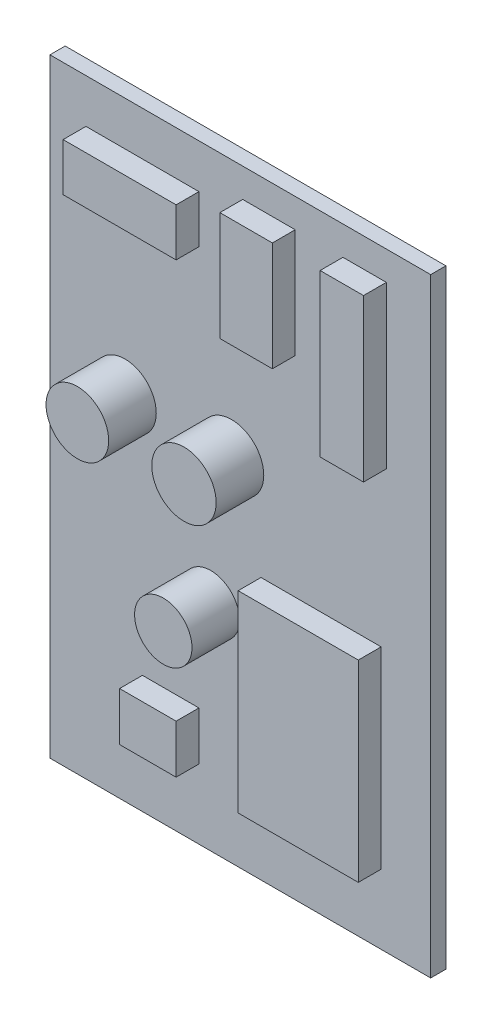
ISO-10303-21;
HEADER;
FILE_DESCRIPTION(('STEP AP214'),'2;1');
FILE_NAME('part.step','',(''),(''),'','','');
FILE_SCHEMA(('AUTOMOTIVE_DESIGN { 1 0 10303 214 1 1 1 1 }'));
ENDSEC;
DATA;
#1=APPLICATION_CONTEXT('core data for automotive mechanical design processes');
#2=APPLICATION_PROTOCOL_DEFINITION('international standard','automotive_design',2000,#1);
#3=PRODUCT_CONTEXT('',#1,'mechanical');
#4=PRODUCT('Part','Part','',(#3));
#5=PRODUCT_RELATED_PRODUCT_CATEGORY('part','',(#4));
#6=PRODUCT_DEFINITION_FORMATION('','',#4);
#7=PRODUCT_DEFINITION_CONTEXT('part definition',#1,'design');
#8=PRODUCT_DEFINITION('design','',#6,#7);
#9=PRODUCT_DEFINITION_SHAPE('','',#8);
#10=(LENGTH_UNIT() NAMED_UNIT(*) SI_UNIT(.MILLI.,.METRE.));
#11=(NAMED_UNIT(*) PLANE_ANGLE_UNIT() SI_UNIT($,.RADIAN.));
#12=(NAMED_UNIT(*) SI_UNIT($,.STERADIAN.) SOLID_ANGLE_UNIT());
#13=UNCERTAINTY_MEASURE_WITH_UNIT(LENGTH_MEASURE(1.E-05),#10,'distance_accuracy_value','');
#14=(GEOMETRIC_REPRESENTATION_CONTEXT(3) GLOBAL_UNCERTAINTY_ASSIGNED_CONTEXT((#13)) GLOBAL_UNIT_ASSIGNED_CONTEXT((#10,
#11,#12)) REPRESENTATION_CONTEXT('',''));
#15=CARTESIAN_POINT('',(0.,0.,0.));
#16=DIRECTION('',(0.,0.,1.));
#17=DIRECTION('',(1.,0.,0.));
#18=AXIS2_PLACEMENT_3D('',#15,#16,#17);
#19=CARTESIAN_POINT('',(0.,0.,1.016));
#20=DIRECTION('',(0.,0.,1.));
#21=DIRECTION('',(1.,0.,0.));
#22=AXIS2_PLACEMENT_3D('',#19,#20,#21);
#23=PLANE('',#22);
#24=CARTESIAN_POINT('',(-11.7065261025188,-8.86064125228403,1.016));
#25=DIRECTION('',(0.,0.,1.));
#26=DIRECTION('',(1.,0.,0.));
#27=AXIS2_PLACEMENT_3D('',#24,#25,#26);
#28=CIRCLE('',#27,1.91392440453094);
#29=CARTESIAN_POINT('',(-9.79260169798782,-8.86064125228403,1.016));
#30=VERTEX_POINT('',#29);
#31=EDGE_CURVE('E365',#30,#30,#28,.T.);
#32=ORIENTED_EDGE('',*,*,#31,.F.);
#33=EDGE_LOOP('',(#32));
#34=FACE_BOUND('',#33,.T.);
#35=CARTESIAN_POINT('',(-10.3263755869391,0.322667947534334,1.016));
#36=DIRECTION('',(0.,0.,1.));
#37=DIRECTION('',(1.,0.,0.));
#38=AXIS2_PLACEMENT_3D('',#35,#36,#37);
#39=CIRCLE('',#38,2.14768562154534);
#40=CARTESIAN_POINT('',(-8.17868996539378,0.322667947534334,1.016));
#41=VERTEX_POINT('',#40);
#42=EDGE_CURVE('E371',#41,#41,#39,.T.);
#43=ORIENTED_EDGE('',*,*,#42,.F.);
#44=EDGE_LOOP('',(#43));
#45=FACE_BOUND('',#44,.T.);
#46=CARTESIAN_POINT('',(-17.439459013388,0.322667947534334,1.016));
#47=DIRECTION('',(0.,0.,1.));
#48=DIRECTION('',(1.,0.,0.));
#49=AXIS2_PLACEMENT_3D('',#46,#47,#48);
#50=CIRCLE('',#49,2.08919420684247);
#51=CARTESIAN_POINT('',(-15.3502648065456,0.322667947534334,1.016));
#52=VERTEX_POINT('',#51);
#53=EDGE_CURVE('E374',#52,#52,#50,.T.);
#54=ORIENTED_EDGE('',*,*,#53,.F.);
#55=EDGE_LOOP('',(#54));
#56=FACE_BOUND('',#55,.T.);
#57=DIRECTION('',(0.,-1.,0.));
#58=VECTOR('',#57,1.);
#59=CARTESIAN_POINT('',(-22.4424657534247,17.4842465753425,1.016));
#60=LINE('',#59,#58);
#61=CARTESIAN_POINT('',(-22.4424657534247,17.4842465753425,1.016));
#62=VERTEX_POINT('',#61);
#63=CARTESIAN_POINT('',(-22.4424657534247,-23.1557534246575,1.016));
#64=VERTEX_POINT('',#63);
#65=EDGE_CURVE('E383',#62,#64,#60,.T.);
#66=ORIENTED_EDGE('',*,*,#65,.T.);
#67=DIRECTION('',(1.,0.,0.));
#68=VECTOR('',#67,1.);
#69=CARTESIAN_POINT('',(-22.4424657534247,-23.1557534246575,1.016));
#70=LINE('',#69,#68);
#71=CARTESIAN_POINT('',(2.95753424657534,-23.1557534246575,1.016));
#72=VERTEX_POINT('',#71);
#73=EDGE_CURVE('E386',#64,#72,#70,.T.);
#74=ORIENTED_EDGE('',*,*,#73,.T.);
#75=DIRECTION('',(0.,1.,0.));
#76=VECTOR('',#75,1.);
#77=CARTESIAN_POINT('',(2.95753424657534,17.4842465753425,1.016));
#78=LINE('',#77,#76);
#79=CARTESIAN_POINT('',(2.95753424657534,17.4842465753425,1.016));
#80=VERTEX_POINT('',#79);
#81=EDGE_CURVE('E389',#72,#80,#78,.T.);
#82=ORIENTED_EDGE('',*,*,#81,.T.);
#83=DIRECTION('',(-1.,0.,0.));
#84=VECTOR('',#83,1.);
#85=CARTESIAN_POINT('',(-22.4424657534247,17.4842465753425,1.016));
#86=LINE('',#85,#84);
#87=EDGE_CURVE('E391',#80,#62,#86,.T.);
#88=ORIENTED_EDGE('',*,*,#87,.T.);
#89=EDGE_LOOP('',(#66,#74,#82,#88));
#90=FACE_BOUND('',#89,.T.);
#91=DIRECTION('',(-1.,0.,0.));
#92=VECTOR('',#91,1.);
#93=CARTESIAN_POINT('',(0.,4.78161576709931,1.016));
#94=LINE('',#93,#92);
#95=CARTESIAN_POINT('',(0.,4.78161576709931,1.016));
#96=VERTEX_POINT('',#95);
#97=CARTESIAN_POINT('',(-2.89479588766414,4.78161576709931,1.016));
#98=VERTEX_POINT('',#97);
#99=EDGE_CURVE('E358',#96,#98,#94,.T.);
#100=ORIENTED_EDGE('',*,*,#99,.T.);
#101=DIRECTION('',(0.,1.,0.));
#102=VECTOR('',#101,1.);
#103=CARTESIAN_POINT('',(-2.89479588766414,0.,1.016));
#104=LINE('',#103,#102);
#105=CARTESIAN_POINT('',(-2.89479588766414,15.557406331048,1.016));
#106=VERTEX_POINT('',#105);
#107=EDGE_CURVE('E361',#98,#106,#104,.T.);
#108=ORIENTED_EDGE('',*,*,#107,.T.);
#109=DIRECTION('',(1.,0.,0.));
#110=VECTOR('',#109,1.);
#111=CARTESIAN_POINT('',(0.,15.557406331048,1.016));
#112=LINE('',#111,#110);
#113=CARTESIAN_POINT('',(0.,15.557406331048,1.016));
#114=VERTEX_POINT('',#113);
#115=EDGE_CURVE('E352',#106,#114,#112,.T.);
#116=ORIENTED_EDGE('',*,*,#115,.T.);
#117=DIRECTION('',(0.,-1.,0.));
#118=VECTOR('',#117,1.);
#119=CARTESIAN_POINT('',(0.,0.,1.016));
#120=LINE('',#119,#118);
#121=EDGE_CURVE('E355',#114,#96,#120,.T.);
#122=ORIENTED_EDGE('',*,*,#121,.T.);
#123=EDGE_LOOP('',(#100,#108,#116,#122));
#124=FACE_BOUND('',#123,.T.);
#125=DIRECTION('',(-1.,0.,0.));
#126=VECTOR('',#125,1.);
#127=CARTESIAN_POINT('',(0.,8.28507476818609,1.016));
#128=LINE('',#127,#126);
#129=CARTESIAN_POINT('',(-6.07975861592485,8.28507476818609,1.016));
#130=VERTEX_POINT('',#129);
#131=CARTESIAN_POINT('',(-9.58321761701162,8.28507476818609,1.016));
#132=VERTEX_POINT('',#131);
#133=EDGE_CURVE('E326',#130,#132,#128,.T.);
#134=ORIENTED_EDGE('',*,*,#133,.T.);
#135=DIRECTION('',(0.,1.,0.));
#136=VECTOR('',#135,1.);
#137=CARTESIAN_POINT('',(-9.58321761701162,0.,1.016));
#138=LINE('',#137,#136);
#139=CARTESIAN_POINT('',(-9.58321761701162,15.557406331048,1.016));
#140=VERTEX_POINT('',#139);
#141=EDGE_CURVE('E329',#132,#140,#138,.T.);
#142=ORIENTED_EDGE('',*,*,#141,.T.);
#143=DIRECTION('',(1.,0.,0.));
#144=VECTOR('',#143,1.);
#145=CARTESIAN_POINT('',(0.,15.557406331048,1.016));
#146=LINE('',#145,#144);
#147=CARTESIAN_POINT('',(-6.07975861592485,15.557406331048,1.016));
#148=VERTEX_POINT('',#147);
#149=EDGE_CURVE('E320',#140,#148,#146,.T.);
#150=ORIENTED_EDGE('',*,*,#149,.T.);
#151=DIRECTION('',(0.,-1.,0.));
#152=VECTOR('',#151,1.);
#153=CARTESIAN_POINT('',(-6.07975861592485,0.,1.016));
#154=LINE('',#153,#152);
#155=EDGE_CURVE('E323',#148,#130,#154,.T.);
#156=ORIENTED_EDGE('',*,*,#155,.T.);
#157=EDGE_LOOP('',(#134,#142,#150,#156));
#158=FACE_BOUND('',#157,.T.);
#159=DIRECTION('',(-1.,0.,0.));
#160=VECTOR('',#159,1.);
#161=CARTESIAN_POINT('',(0.,11.3638720721714,1.016));
#162=LINE('',#161,#160);
#163=CARTESIAN_POINT('',(-12.5027667845839,11.3638720721714,1.016));
#164=VERTEX_POINT('',#163);
#165=CARTESIAN_POINT('',(-20.0405119081343,11.3638720721714,1.016));
#166=VERTEX_POINT('',#165);
#167=EDGE_CURVE('E294',#164,#166,#162,.T.);
#168=ORIENTED_EDGE('',*,*,#167,.T.);
#169=DIRECTION('',(0.,1.,0.));
#170=VECTOR('',#169,1.);
#171=CARTESIAN_POINT('',(-20.0405119081343,0.,1.016));
#172=LINE('',#171,#170);
#173=CARTESIAN_POINT('',(-20.0405119081343,14.5488348004321,1.016));
#174=VERTEX_POINT('',#173);
#175=EDGE_CURVE('E297',#166,#174,#172,.T.);
#176=ORIENTED_EDGE('',*,*,#175,.T.);
#177=DIRECTION('',(1.,0.,0.));
#178=VECTOR('',#177,1.);
#179=CARTESIAN_POINT('',(0.,14.5488348004321,1.016));
#180=LINE('',#179,#178);
#181=CARTESIAN_POINT('',(-12.5027667845839,14.5488348004321,1.016));
#182=VERTEX_POINT('',#181);
#183=EDGE_CURVE('E288',#174,#182,#180,.T.);
#184=ORIENTED_EDGE('',*,*,#183,.T.);
#185=DIRECTION('',(0.,-1.,0.));
#186=VECTOR('',#185,1.);
#187=CARTESIAN_POINT('',(-12.5027667845839,0.,1.016));
#188=LINE('',#187,#186);
#189=EDGE_CURVE('E291',#182,#164,#188,.T.);
#190=ORIENTED_EDGE('',*,*,#189,.T.);
#191=EDGE_LOOP('',(#168,#176,#184,#190));
#192=FACE_BOUND('',#191,.T.);
#193=DIRECTION('',(-1.,0.,0.));
#194=VECTOR('',#193,1.);
#195=CARTESIAN_POINT('',(0.,-18.5216948613415,1.016));
#196=LINE('',#195,#194);
#197=CARTESIAN_POINT('',(-12.5027667845839,-18.5216948613415,1.016));
#198=VERTEX_POINT('',#197);
#199=CARTESIAN_POINT('',(-16.2716393463591,-18.5216948613415,1.016));
#200=VERTEX_POINT('',#199);
#201=EDGE_CURVE('E262',#198,#200,#196,.T.);
#202=ORIENTED_EDGE('',*,*,#201,.T.);
#203=DIRECTION('',(0.,1.,0.));
#204=VECTOR('',#203,1.);
#205=CARTESIAN_POINT('',(-16.2716393463591,0.,1.016));
#206=LINE('',#205,#204);
#207=CARTESIAN_POINT('',(-16.2716393463591,-15.2836494209431,1.016));
#208=VERTEX_POINT('',#207);
#209=EDGE_CURVE('E265',#200,#208,#206,.T.);
#210=ORIENTED_EDGE('',*,*,#209,.T.);
#211=DIRECTION('',(1.,0.,0.));
#212=VECTOR('',#211,1.);
#213=CARTESIAN_POINT('',(0.,-15.2836494209431,1.016));
#214=LINE('',#213,#212);
#215=CARTESIAN_POINT('',(-12.5027667845839,-15.2836494209431,1.016));
#216=VERTEX_POINT('',#215);
#217=EDGE_CURVE('E256',#208,#216,#214,.T.);
#218=ORIENTED_EDGE('',*,*,#217,.T.);
#219=DIRECTION('',(0.,-1.,0.));
#220=VECTOR('',#219,1.);
#221=CARTESIAN_POINT('',(-12.5027667845839,0.,1.016));
#222=LINE('',#221,#220);
#223=EDGE_CURVE('E259',#216,#198,#222,.T.);
#224=ORIENTED_EDGE('',*,*,#223,.T.);
#225=EDGE_LOOP('',(#202,#210,#218,#224));
#226=FACE_BOUND('',#225,.T.);
#227=DIRECTION('',(-1.,0.,0.));
#228=VECTOR('',#227,1.);
#229=CARTESIAN_POINT('',(0.,-18.5216948613415,1.016));
#230=LINE('',#229,#228);
#231=CARTESIAN_POINT('',(-0.346825705055578,-18.5216948613415,1.016));
#232=VERTEX_POINT('',#231);
#233=CARTESIAN_POINT('',(-8.36231523784502,-18.5216948613415,1.016));
#234=VERTEX_POINT('',#233);
#235=EDGE_CURVE('E232',#232,#234,#230,.T.);
#236=ORIENTED_EDGE('',*,*,#235,.T.);
#237=DIRECTION('',(0.,1.,0.));
#238=VECTOR('',#237,1.);
#239=CARTESIAN_POINT('',(-8.36231523784502,0.,1.016));
#240=LINE('',#239,#238);
#241=CARTESIAN_POINT('',(-8.36231523784502,-5.67567852402333,1.016));
#242=VERTEX_POINT('',#241);
#243=EDGE_CURVE('E235',#234,#242,#240,.T.);
#244=ORIENTED_EDGE('',*,*,#243,.T.);
#245=DIRECTION('',(1.,0.,0.));
#246=VECTOR('',#245,1.);
#247=CARTESIAN_POINT('',(0.,-5.67567852402333,1.016));
#248=LINE('',#247,#246);
#249=CARTESIAN_POINT('',(-0.346825705055578,-5.67567852402333,1.016));
#250=VERTEX_POINT('',#249);
#251=EDGE_CURVE('E216',#242,#250,#248,.T.);
#252=ORIENTED_EDGE('',*,*,#251,.T.);
#253=DIRECTION('',(0.,-1.,0.));
#254=VECTOR('',#253,1.);
#255=CARTESIAN_POINT('',(-0.346825705055578,0.,1.016));
#256=LINE('',#255,#254);
#257=EDGE_CURVE('E225',#250,#232,#256,.T.);
#258=ORIENTED_EDGE('',*,*,#257,.T.);
#259=EDGE_LOOP('',(#236,#244,#252,#258));
#260=FACE_BOUND('',#259,.T.);
#261=ADVANCED_FACE('F41',(#34,#45,#56,#90,#124,#158,#192,#226,#260),#23,.T.);
#262=CARTESIAN_POINT('',(-22.4424657534247,17.4842465753425,1.016));
#263=DIRECTION('',(1.,0.,0.));
#264=DIRECTION('',(0.,0.,-1.));
#265=AXIS2_PLACEMENT_3D('',#262,#263,#264);
#266=PLANE('',#265);
#267=DIRECTION('',(0.,-1.,0.));
#268=VECTOR('',#267,1.);
#269=CARTESIAN_POINT('',(-22.4424657534247,17.4842465753425,0.));
#270=LINE('',#269,#268);
#271=CARTESIAN_POINT('',(-22.4424657534247,17.4842465753425,0.));
#272=VERTEX_POINT('',#271);
#273=CARTESIAN_POINT('',(-22.4424657534247,-23.1557534246575,0.));
#274=VERTEX_POINT('',#273);
#275=EDGE_CURVE('E380',#272,#274,#270,.T.);
#276=ORIENTED_EDGE('',*,*,#275,.T.);
#277=DIRECTION('',(0.,0.,-1.));
#278=VECTOR('',#277,1.);
#279=CARTESIAN_POINT('',(-22.4424657534247,-23.1557534246575,1.016));
#280=LINE('',#279,#278);
#281=EDGE_CURVE('E11',#64,#274,#280,.T.);
#282=ORIENTED_EDGE('',*,*,#281,.F.);
#283=ORIENTED_EDGE('',*,*,#65,.F.);
#284=DIRECTION('',(0.,0.,-1.));
#285=VECTOR('',#284,1.);
#286=CARTESIAN_POINT('',(-22.4424657534247,17.4842465753425,1.016));
#287=LINE('',#286,#285);
#288=EDGE_CURVE('E393',#62,#272,#287,.T.);
#289=ORIENTED_EDGE('',*,*,#288,.T.);
#290=EDGE_LOOP('',(#276,#282,#283,#289));
#291=FACE_BOUND('',#290,.T.);
#292=ADVANCED_FACE('F43',(#291),#266,.F.);
#293=CARTESIAN_POINT('',(-22.4424657534247,-23.1557534246575,1.016));
#294=DIRECTION('',(0.,1.,0.));
#295=DIRECTION('',(0.,0.,1.));
#296=AXIS2_PLACEMENT_3D('',#293,#294,#295);
#297=PLANE('',#296);
#298=DIRECTION('',(1.,0.,0.));
#299=VECTOR('',#298,1.);
#300=CARTESIAN_POINT('',(-22.4424657534247,-23.1557534246575,0.));
#301=LINE('',#300,#299);
#302=CARTESIAN_POINT('',(2.95753424657534,-23.1557534246575,0.));
#303=VERTEX_POINT('',#302);
#304=EDGE_CURVE('E396',#274,#303,#301,.T.);
#305=ORIENTED_EDGE('',*,*,#304,.T.);
#306=DIRECTION('',(0.,0.,-1.));
#307=VECTOR('',#306,1.);
#308=CARTESIAN_POINT('',(2.95753424657534,-23.1557534246575,1.016));
#309=LINE('',#308,#307);
#310=EDGE_CURVE('E49',#72,#303,#309,.T.);
#311=ORIENTED_EDGE('',*,*,#310,.F.);
#312=ORIENTED_EDGE('',*,*,#73,.F.);
#313=ORIENTED_EDGE('',*,*,#281,.T.);
#314=EDGE_LOOP('',(#305,#311,#312,#313));
#315=FACE_BOUND('',#314,.T.);
#316=ADVANCED_FACE('F426',(#315),#297,.F.);
#317=CARTESIAN_POINT('',(2.95753424657534,17.4842465753425,1.016));
#318=DIRECTION('',(-1.,0.,0.));
#319=DIRECTION('',(0.,-1.,0.));
#320=AXIS2_PLACEMENT_3D('',#317,#318,#319);
#321=PLANE('',#320);
#322=DIRECTION('',(0.,1.,0.));
#323=VECTOR('',#322,1.);
#324=CARTESIAN_POINT('',(2.95753424657534,17.4842465753425,0.));
#325=LINE('',#324,#323);
#326=CARTESIAN_POINT('',(2.95753424657534,17.4842465753425,0.));
#327=VERTEX_POINT('',#326);
#328=EDGE_CURVE('E398',#303,#327,#325,.T.);
#329=ORIENTED_EDGE('',*,*,#328,.T.);
#330=DIRECTION('',(0.,0.,-1.));
#331=VECTOR('',#330,1.);
#332=CARTESIAN_POINT('',(2.95753424657534,17.4842465753425,1.016));
#333=LINE('',#332,#331);
#334=EDGE_CURVE('E403',#80,#327,#333,.T.);
#335=ORIENTED_EDGE('',*,*,#334,.F.);
#336=ORIENTED_EDGE('',*,*,#81,.F.);
#337=ORIENTED_EDGE('',*,*,#310,.T.);
#338=EDGE_LOOP('',(#329,#335,#336,#337));
#339=FACE_BOUND('',#338,.T.);
#340=ADVANCED_FACE('F410',(#339),#321,.F.);
#341=CARTESIAN_POINT('',(-22.4424657534247,17.4842465753425,1.016));
#342=DIRECTION('',(0.,-1.,0.));
#343=DIRECTION('',(0.,0.,-1.));
#344=AXIS2_PLACEMENT_3D('',#341,#342,#343);
#345=PLANE('',#344);
#346=DIRECTION('',(-1.,0.,0.));
#347=VECTOR('',#346,1.);
#348=CARTESIAN_POINT('',(-22.4424657534247,17.4842465753425,0.));
#349=LINE('',#348,#347);
#350=EDGE_CURVE('E387',#327,#272,#349,.T.);
#351=ORIENTED_EDGE('',*,*,#350,.T.);
#352=ORIENTED_EDGE('',*,*,#288,.F.);
#353=ORIENTED_EDGE('',*,*,#87,.F.);
#354=ORIENTED_EDGE('',*,*,#334,.T.);
#355=EDGE_LOOP('',(#351,#352,#353,#354));
#356=FACE_BOUND('',#355,.T.);
#357=ADVANCED_FACE('F419',(#356),#345,.F.);
#358=CARTESIAN_POINT('',(0.,0.,0.));
#359=DIRECTION('',(0.,0.,1.));
#360=DIRECTION('',(1.,0.,0.));
#361=AXIS2_PLACEMENT_3D('',#358,#359,#360);
#362=PLANE('',#361);
#363=ORIENTED_EDGE('',*,*,#275,.F.);
#364=ORIENTED_EDGE('',*,*,#350,.F.);
#365=ORIENTED_EDGE('',*,*,#328,.F.);
#366=ORIENTED_EDGE('',*,*,#304,.F.);
#367=EDGE_LOOP('',(#363,#364,#365,#366));
#368=FACE_BOUND('',#367,.T.);
#369=ADVANCED_FACE('F416',(#368),#362,.F.);
#370=CARTESIAN_POINT('',(-17.439459013388,0.322667947534334,4.191));
#371=DIRECTION('',(0.,0.,-1.));
#372=DIRECTION('',(-1.,0.,0.));
#373=AXIS2_PLACEMENT_3D('',#370,#371,#372);
#374=CYLINDRICAL_SURFACE('',#373,2.08919420684247);
#375=CARTESIAN_POINT('',(-17.439459013388,0.322667947534334,4.191));
#376=DIRECTION('',(0.,0.,1.));
#377=DIRECTION('',(1.,0.,0.));
#378=AXIS2_PLACEMENT_3D('',#375,#376,#377);
#379=CIRCLE('',#378,2.08919420684247);
#380=CARTESIAN_POINT('',(-15.3502648065456,0.322667947534334,4.191));
#381=VERTEX_POINT('',#380);
#382=EDGE_CURVE('E377',#381,#381,#379,.T.);
#383=ORIENTED_EDGE('',*,*,#382,.F.);
#384=EDGE_LOOP('',(#383));
#385=FACE_BOUND('',#384,.T.);
#386=ORIENTED_EDGE('',*,*,#53,.T.);
#387=EDGE_LOOP('',(#386));
#388=FACE_BOUND('',#387,.T.);
#389=ADVANCED_FACE('F442',(#385,#388),#374,.T.);
#390=CARTESIAN_POINT('',(-17.439459013388,0.322667947534334,4.191));
#391=DIRECTION('',(0.,0.,1.));
#392=DIRECTION('',(1.,0.,0.));
#393=AXIS2_PLACEMENT_3D('',#390,#391,#392);
#394=PLANE('',#393);
#395=ORIENTED_EDGE('',*,*,#382,.T.);
#396=EDGE_LOOP('',(#395));
#397=FACE_BOUND('',#396,.T.);
#398=ADVANCED_FACE('F462',(#397),#394,.T.);
#399=CARTESIAN_POINT('',(-10.3263755869391,0.322667947534334,4.191));
#400=DIRECTION('',(0.,0.,-1.));
#401=DIRECTION('',(-1.,0.,0.));
#402=AXIS2_PLACEMENT_3D('',#399,#400,#401);
#403=CYLINDRICAL_SURFACE('',#402,2.14768562154534);
#404=CARTESIAN_POINT('',(-10.3263755869391,0.322667947534334,4.191));
#405=DIRECTION('',(0.,0.,1.));
#406=DIRECTION('',(1.,0.,0.));
#407=AXIS2_PLACEMENT_3D('',#404,#405,#406);
#408=CIRCLE('',#407,2.14768562154534);
#409=CARTESIAN_POINT('',(-8.17868996539378,0.322667947534334,4.191));
#410=VERTEX_POINT('',#409);
#411=EDGE_CURVE('E368',#410,#410,#408,.T.);
#412=ORIENTED_EDGE('',*,*,#411,.F.);
#413=EDGE_LOOP('',(#412));
#414=FACE_BOUND('',#413,.T.);
#415=ORIENTED_EDGE('',*,*,#42,.T.);
#416=EDGE_LOOP('',(#415));
#417=FACE_BOUND('',#416,.T.);
#418=ADVANCED_FACE('F469',(#414,#417),#403,.T.);
#419=CARTESIAN_POINT('',(-10.3263755869391,0.322667947534334,4.191));
#420=DIRECTION('',(0.,0.,1.));
#421=DIRECTION('',(1.,0.,0.));
#422=AXIS2_PLACEMENT_3D('',#419,#420,#421);
#423=PLANE('',#422);
#424=ORIENTED_EDGE('',*,*,#411,.T.);
#425=EDGE_LOOP('',(#424));
#426=FACE_BOUND('',#425,.T.);
#427=ADVANCED_FACE('F476',(#426),#423,.T.);
#428=CARTESIAN_POINT('',(-11.7065261025188,-8.86064125228403,4.191));
#429=DIRECTION('',(0.,0.,-1.));
#430=DIRECTION('',(-1.,0.,0.));
#431=AXIS2_PLACEMENT_3D('',#428,#429,#430);
#432=CYLINDRICAL_SURFACE('',#431,1.91392440453094);
#433=CARTESIAN_POINT('',(-11.7065261025188,-8.86064125228403,4.191));
#434=DIRECTION('',(0.,0.,1.));
#435=DIRECTION('',(1.,0.,0.));
#436=AXIS2_PLACEMENT_3D('',#433,#434,#435);
#437=CIRCLE('',#436,1.91392440453094);
#438=CARTESIAN_POINT('',(-9.79260169798782,-8.86064125228403,4.191));
#439=VERTEX_POINT('',#438);
#440=EDGE_CURVE('E364',#439,#439,#437,.T.);
#441=ORIENTED_EDGE('',*,*,#440,.F.);
#442=EDGE_LOOP('',(#441));
#443=FACE_BOUND('',#442,.T.);
#444=ORIENTED_EDGE('',*,*,#31,.T.);
#445=EDGE_LOOP('',(#444));
#446=FACE_BOUND('',#445,.T.);
#447=ADVANCED_FACE('F484',(#443,#446),#432,.T.);
#448=CARTESIAN_POINT('',(-11.7065261025188,-8.86064125228403,4.191));
#449=DIRECTION('',(0.,0.,1.));
#450=DIRECTION('',(1.,0.,0.));
#451=AXIS2_PLACEMENT_3D('',#448,#449,#450);
#452=PLANE('',#451);
#453=ORIENTED_EDGE('',*,*,#440,.T.);
#454=EDGE_LOOP('',(#453));
#455=FACE_BOUND('',#454,.T.);
#456=ADVANCED_FACE('F492',(#455),#452,.T.);
#457=CARTESIAN_POINT('',(-2.89479588766414,15.557406331048,2.54));
#458=DIRECTION('',(1.,0.,0.));
#459=DIRECTION('',(0.,0.,-1.));
#460=AXIS2_PLACEMENT_3D('',#457,#458,#459);
#461=PLANE('',#460);
#462=ORIENTED_EDGE('',*,*,#107,.F.);
#463=DIRECTION('',(0.,0.,-1.));
#464=VECTOR('',#463,1.);
#465=CARTESIAN_POINT('',(-2.89479588766414,4.78161576709931,2.54));
#466=LINE('',#465,#464);
#467=CARTESIAN_POINT('',(-2.89479588766414,4.78161576709931,2.54));
#468=VERTEX_POINT('',#467);
#469=EDGE_CURVE('E349',#468,#98,#466,.T.);
#470=ORIENTED_EDGE('',*,*,#469,.F.);
#471=DIRECTION('',(0.,-1.,0.));
#472=VECTOR('',#471,1.);
#473=CARTESIAN_POINT('',(-2.89479588766414,15.557406331048,2.54));
#474=LINE('',#473,#472);
#475=CARTESIAN_POINT('',(-2.89479588766414,15.557406331048,2.54));
#476=VERTEX_POINT('',#475);
#477=EDGE_CURVE('E332',#476,#468,#474,.T.);
#478=ORIENTED_EDGE('',*,*,#477,.F.);
#479=DIRECTION('',(0.,0.,-1.));
#480=VECTOR('',#479,1.);
#481=CARTESIAN_POINT('',(-2.89479588766414,15.557406331048,2.54));
#482=LINE('',#481,#480);
#483=EDGE_CURVE('E341',#476,#106,#482,.T.);
#484=ORIENTED_EDGE('',*,*,#483,.T.);
#485=EDGE_LOOP('',(#462,#470,#478,#484));
#486=FACE_BOUND('',#485,.T.);
#487=ADVANCED_FACE('F500',(#486),#461,.F.);
#488=CARTESIAN_POINT('',(-2.89479588766414,4.78161576709931,2.54));
#489=DIRECTION('',(0.,1.,0.));
#490=DIRECTION('',(0.,0.,1.));
#491=AXIS2_PLACEMENT_3D('',#488,#489,#490);
#492=PLANE('',#491);
#493=ORIENTED_EDGE('',*,*,#99,.F.);
#494=DIRECTION('',(0.,0.,-1.));
#495=VECTOR('',#494,1.);
#496=CARTESIAN_POINT('',(0.,4.78161576709931,2.54));
#497=LINE('',#496,#495);
#498=CARTESIAN_POINT('',(0.,4.78161576709931,2.54));
#499=VERTEX_POINT('',#498);
#500=EDGE_CURVE('E346',#499,#96,#497,.T.);
#501=ORIENTED_EDGE('',*,*,#500,.F.);
#502=DIRECTION('',(1.,0.,0.));
#503=VECTOR('',#502,1.);
#504=CARTESIAN_POINT('',(-2.89479588766414,4.78161576709931,2.54));
#505=LINE('',#504,#503);
#506=EDGE_CURVE('E335',#468,#499,#505,.T.);
#507=ORIENTED_EDGE('',*,*,#506,.F.);
#508=ORIENTED_EDGE('',*,*,#469,.T.);
#509=EDGE_LOOP('',(#493,#501,#507,#508));
#510=FACE_BOUND('',#509,.T.);
#511=ADVANCED_FACE('F507',(#510),#492,.F.);
#512=CARTESIAN_POINT('',(0.,15.557406331048,2.54));
#513=DIRECTION('',(-1.,0.,0.));
#514=DIRECTION('',(0.,0.,1.));
#515=AXIS2_PLACEMENT_3D('',#512,#513,#514);
#516=PLANE('',#515);
#517=ORIENTED_EDGE('',*,*,#121,.F.);
#518=DIRECTION('',(0.,0.,-1.));
#519=VECTOR('',#518,1.);
#520=CARTESIAN_POINT('',(0.,15.557406331048,2.54));
#521=LINE('',#520,#519);
#522=CARTESIAN_POINT('',(0.,15.557406331048,2.54));
#523=VERTEX_POINT('',#522);
#524=EDGE_CURVE('E344',#523,#114,#521,.T.);
#525=ORIENTED_EDGE('',*,*,#524,.F.);
#526=DIRECTION('',(0.,1.,0.));
#527=VECTOR('',#526,1.);
#528=CARTESIAN_POINT('',(0.,15.557406331048,2.54));
#529=LINE('',#528,#527);
#530=EDGE_CURVE('E337',#499,#523,#529,.T.);
#531=ORIENTED_EDGE('',*,*,#530,.F.);
#532=ORIENTED_EDGE('',*,*,#500,.T.);
#533=EDGE_LOOP('',(#517,#525,#531,#532));
#534=FACE_BOUND('',#533,.T.);
#535=ADVANCED_FACE('F515',(#534),#516,.F.);
#536=CARTESIAN_POINT('',(-2.89479588766414,15.557406331048,2.54));
#537=DIRECTION('',(0.,-1.,0.));
#538=DIRECTION('',(0.,0.,-1.));
#539=AXIS2_PLACEMENT_3D('',#536,#537,#538);
#540=PLANE('',#539);
#541=ORIENTED_EDGE('',*,*,#115,.F.);
#542=ORIENTED_EDGE('',*,*,#483,.F.);
#543=DIRECTION('',(-1.,0.,0.));
#544=VECTOR('',#543,1.);
#545=CARTESIAN_POINT('',(-2.89479588766414,15.557406331048,2.54));
#546=LINE('',#545,#544);
#547=EDGE_CURVE('E339',#523,#476,#546,.T.);
#548=ORIENTED_EDGE('',*,*,#547,.F.);
#549=ORIENTED_EDGE('',*,*,#524,.T.);
#550=EDGE_LOOP('',(#541,#542,#548,#549));
#551=FACE_BOUND('',#550,.T.);
#552=ADVANCED_FACE('F523',(#551),#540,.F.);
#553=CARTESIAN_POINT('',(0.,0.,2.54));
#554=DIRECTION('',(0.,0.,1.));
#555=DIRECTION('',(1.,0.,0.));
#556=AXIS2_PLACEMENT_3D('',#553,#554,#555);
#557=PLANE('',#556);
#558=ORIENTED_EDGE('',*,*,#477,.T.);
#559=ORIENTED_EDGE('',*,*,#506,.T.);
#560=ORIENTED_EDGE('',*,*,#530,.T.);
#561=ORIENTED_EDGE('',*,*,#547,.T.);
#562=EDGE_LOOP('',(#558,#559,#560,#561));
#563=FACE_BOUND('',#562,.T.);
#564=ADVANCED_FACE('F531',(#563),#557,.T.);
#565=CARTESIAN_POINT('',(-9.58321761701162,15.557406331048,2.54));
#566=DIRECTION('',(1.,0.,0.));
#567=DIRECTION('',(0.,0.,-1.));
#568=AXIS2_PLACEMENT_3D('',#565,#566,#567);
#569=PLANE('',#568);
#570=ORIENTED_EDGE('',*,*,#141,.F.);
#571=DIRECTION('',(0.,0.,-1.));
#572=VECTOR('',#571,1.);
#573=CARTESIAN_POINT('',(-9.58321761701162,8.28507476818609,2.54));
#574=LINE('',#573,#572);
#575=CARTESIAN_POINT('',(-9.58321761701162,8.28507476818609,2.54));
#576=VERTEX_POINT('',#575);
#577=EDGE_CURVE('E300',#576,#132,#574,.T.);
#578=ORIENTED_EDGE('',*,*,#577,.F.);
#579=DIRECTION('',(0.,-1.,0.));
#580=VECTOR('',#579,1.);
#581=CARTESIAN_POINT('',(-9.58321761701162,15.557406331048,2.54));
#582=LINE('',#581,#580);
#583=CARTESIAN_POINT('',(-9.58321761701162,15.557406331048,2.54));
#584=VERTEX_POINT('',#583);
#585=EDGE_CURVE('E317',#584,#576,#582,.T.);
#586=ORIENTED_EDGE('',*,*,#585,.F.);
#587=DIRECTION('',(0.,0.,-1.));
#588=VECTOR('',#587,1.);
#589=CARTESIAN_POINT('',(-9.58321761701162,15.557406331048,2.54));
#590=LINE('',#589,#588);
#591=EDGE_CURVE('E308',#584,#140,#590,.T.);
#592=ORIENTED_EDGE('',*,*,#591,.T.);
#593=EDGE_LOOP('',(#570,#578,#586,#592));
#594=FACE_BOUND('',#593,.T.);
#595=ADVANCED_FACE('F539',(#594),#569,.F.);
#596=CARTESIAN_POINT('',(-9.58321761701162,8.28507476818609,2.54));
#597=DIRECTION('',(0.,1.,0.));
#598=DIRECTION('',(0.,0.,1.));
#599=AXIS2_PLACEMENT_3D('',#596,#597,#598);
#600=PLANE('',#599);
#601=ORIENTED_EDGE('',*,*,#133,.F.);
#602=DIRECTION('',(0.,0.,-1.));
#603=VECTOR('',#602,1.);
#604=CARTESIAN_POINT('',(-6.07975861592485,8.28507476818609,2.54));
#605=LINE('',#604,#603);
#606=CARTESIAN_POINT('',(-6.07975861592485,8.28507476818609,2.54));
#607=VERTEX_POINT('',#606);
#608=EDGE_CURVE('E303',#607,#130,#605,.T.);
#609=ORIENTED_EDGE('',*,*,#608,.F.);
#610=DIRECTION('',(1.,0.,0.));
#611=VECTOR('',#610,1.);
#612=CARTESIAN_POINT('',(-9.58321761701162,8.28507476818609,2.54));
#613=LINE('',#612,#611);
#614=EDGE_CURVE('E315',#576,#607,#613,.T.);
#615=ORIENTED_EDGE('',*,*,#614,.F.);
#616=ORIENTED_EDGE('',*,*,#577,.T.);
#617=EDGE_LOOP('',(#601,#609,#615,#616));
#618=FACE_BOUND('',#617,.T.);
#619=ADVANCED_FACE('F547',(#618),#600,.F.);
#620=CARTESIAN_POINT('',(-6.07975861592485,15.557406331048,2.54));
#621=DIRECTION('',(-1.,0.,0.));
#622=DIRECTION('',(0.,0.,1.));
#623=AXIS2_PLACEMENT_3D('',#620,#621,#622);
#624=PLANE('',#623);
#625=ORIENTED_EDGE('',*,*,#155,.F.);
#626=DIRECTION('',(0.,0.,-1.));
#627=VECTOR('',#626,1.);
#628=CARTESIAN_POINT('',(-6.07975861592485,15.557406331048,2.54));
#629=LINE('',#628,#627);
#630=CARTESIAN_POINT('',(-6.07975861592485,15.557406331048,2.54));
#631=VERTEX_POINT('',#630);
#632=EDGE_CURVE('E306',#631,#148,#629,.T.);
#633=ORIENTED_EDGE('',*,*,#632,.F.);
#634=DIRECTION('',(0.,1.,0.));
#635=VECTOR('',#634,1.);
#636=CARTESIAN_POINT('',(-6.07975861592485,15.557406331048,2.54));
#637=LINE('',#636,#635);
#638=EDGE_CURVE('E313',#607,#631,#637,.T.);
#639=ORIENTED_EDGE('',*,*,#638,.F.);
#640=ORIENTED_EDGE('',*,*,#608,.T.);
#641=EDGE_LOOP('',(#625,#633,#639,#640));
#642=FACE_BOUND('',#641,.T.);
#643=ADVANCED_FACE('F555',(#642),#624,.F.);
#644=CARTESIAN_POINT('',(-9.58321761701162,15.557406331048,2.54));
#645=DIRECTION('',(0.,-1.,0.));
#646=DIRECTION('',(0.,0.,-1.));
#647=AXIS2_PLACEMENT_3D('',#644,#645,#646);
#648=PLANE('',#647);
#649=ORIENTED_EDGE('',*,*,#149,.F.);
#650=ORIENTED_EDGE('',*,*,#591,.F.);
#651=DIRECTION('',(-1.,0.,0.));
#652=VECTOR('',#651,1.);
#653=CARTESIAN_POINT('',(-9.58321761701162,15.557406331048,2.54));
#654=LINE('',#653,#652);
#655=EDGE_CURVE('E311',#631,#584,#654,.T.);
#656=ORIENTED_EDGE('',*,*,#655,.F.);
#657=ORIENTED_EDGE('',*,*,#632,.T.);
#658=EDGE_LOOP('',(#649,#650,#656,#657));
#659=FACE_BOUND('',#658,.T.);
#660=ADVANCED_FACE('F563',(#659),#648,.F.);
#661=CARTESIAN_POINT('',(0.,0.,2.54));
#662=DIRECTION('',(0.,0.,1.));
#663=DIRECTION('',(1.,0.,0.));
#664=AXIS2_PLACEMENT_3D('',#661,#662,#663);
#665=PLANE('',#664);
#666=ORIENTED_EDGE('',*,*,#585,.T.);
#667=ORIENTED_EDGE('',*,*,#614,.T.);
#668=ORIENTED_EDGE('',*,*,#638,.T.);
#669=ORIENTED_EDGE('',*,*,#655,.T.);
#670=EDGE_LOOP('',(#666,#667,#668,#669));
#671=FACE_BOUND('',#670,.T.);
#672=ADVANCED_FACE('F571',(#671),#665,.T.);
#673=CARTESIAN_POINT('',(-20.0405119081343,14.5488348004321,2.54));
#674=DIRECTION('',(1.,0.,0.));
#675=DIRECTION('',(0.,0.,-1.));
#676=AXIS2_PLACEMENT_3D('',#673,#674,#675);
#677=PLANE('',#676);
#678=ORIENTED_EDGE('',*,*,#175,.F.);
#679=DIRECTION('',(0.,0.,-1.));
#680=VECTOR('',#679,1.);
#681=CARTESIAN_POINT('',(-20.0405119081343,11.3638720721714,2.54));
#682=LINE('',#681,#680);
#683=CARTESIAN_POINT('',(-20.0405119081343,11.3638720721714,2.54));
#684=VERTEX_POINT('',#683);
#685=EDGE_CURVE('E268',#684,#166,#682,.T.);
#686=ORIENTED_EDGE('',*,*,#685,.F.);
#687=DIRECTION('',(0.,-1.,0.));
#688=VECTOR('',#687,1.);
#689=CARTESIAN_POINT('',(-20.0405119081343,14.5488348004321,2.54));
#690=LINE('',#689,#688);
#691=CARTESIAN_POINT('',(-20.0405119081343,14.5488348004321,2.54));
#692=VERTEX_POINT('',#691);
#693=EDGE_CURVE('E285',#692,#684,#690,.T.);
#694=ORIENTED_EDGE('',*,*,#693,.F.);
#695=DIRECTION('',(0.,0.,-1.));
#696=VECTOR('',#695,1.);
#697=CARTESIAN_POINT('',(-20.0405119081343,14.5488348004321,2.54));
#698=LINE('',#697,#696);
#699=EDGE_CURVE('E276',#692,#174,#698,.T.);
#700=ORIENTED_EDGE('',*,*,#699,.T.);
#701=EDGE_LOOP('',(#678,#686,#694,#700));
#702=FACE_BOUND('',#701,.T.);
#703=ADVANCED_FACE('F579',(#702),#677,.F.);
#704=CARTESIAN_POINT('',(-20.0405119081343,11.3638720721714,2.54));
#705=DIRECTION('',(0.,1.,0.));
#706=DIRECTION('',(0.,0.,1.));
#707=AXIS2_PLACEMENT_3D('',#704,#705,#706);
#708=PLANE('',#707);
#709=ORIENTED_EDGE('',*,*,#167,.F.);
#710=DIRECTION('',(0.,0.,-1.));
#711=VECTOR('',#710,1.);
#712=CARTESIAN_POINT('',(-12.5027667845839,11.3638720721714,2.54));
#713=LINE('',#712,#711);
#714=CARTESIAN_POINT('',(-12.5027667845839,11.3638720721714,2.54));
#715=VERTEX_POINT('',#714);
#716=EDGE_CURVE('E271',#715,#164,#713,.T.);
#717=ORIENTED_EDGE('',*,*,#716,.F.);
#718=DIRECTION('',(1.,0.,0.));
#719=VECTOR('',#718,1.);
#720=CARTESIAN_POINT('',(-20.0405119081343,11.3638720721714,2.54));
#721=LINE('',#720,#719);
#722=EDGE_CURVE('E283',#684,#715,#721,.T.);
#723=ORIENTED_EDGE('',*,*,#722,.F.);
#724=ORIENTED_EDGE('',*,*,#685,.T.);
#725=EDGE_LOOP('',(#709,#717,#723,#724));
#726=FACE_BOUND('',#725,.T.);
#727=ADVANCED_FACE('F587',(#726),#708,.F.);
#728=CARTESIAN_POINT('',(-12.5027667845839,14.5488348004321,2.54));
#729=DIRECTION('',(-1.,0.,0.));
#730=DIRECTION('',(0.,0.,1.));
#731=AXIS2_PLACEMENT_3D('',#728,#729,#730);
#732=PLANE('',#731);
#733=ORIENTED_EDGE('',*,*,#189,.F.);
#734=DIRECTION('',(0.,0.,-1.));
#735=VECTOR('',#734,1.);
#736=CARTESIAN_POINT('',(-12.5027667845839,14.5488348004321,2.54));
#737=LINE('',#736,#735);
#738=CARTESIAN_POINT('',(-12.5027667845839,14.5488348004321,2.54));
#739=VERTEX_POINT('',#738);
#740=EDGE_CURVE('E274',#739,#182,#737,.T.);
#741=ORIENTED_EDGE('',*,*,#740,.F.);
#742=DIRECTION('',(0.,1.,0.));
#743=VECTOR('',#742,1.);
#744=CARTESIAN_POINT('',(-12.5027667845839,14.5488348004321,2.54));
#745=LINE('',#744,#743);
#746=EDGE_CURVE('E281',#715,#739,#745,.T.);
#747=ORIENTED_EDGE('',*,*,#746,.F.);
#748=ORIENTED_EDGE('',*,*,#716,.T.);
#749=EDGE_LOOP('',(#733,#741,#747,#748));
#750=FACE_BOUND('',#749,.T.);
#751=ADVANCED_FACE('F595',(#750),#732,.F.);
#752=CARTESIAN_POINT('',(-20.0405119081343,14.5488348004321,2.54));
#753=DIRECTION('',(0.,-1.,0.));
#754=DIRECTION('',(0.,0.,-1.));
#755=AXIS2_PLACEMENT_3D('',#752,#753,#754);
#756=PLANE('',#755);
#757=ORIENTED_EDGE('',*,*,#183,.F.);
#758=ORIENTED_EDGE('',*,*,#699,.F.);
#759=DIRECTION('',(-1.,0.,0.));
#760=VECTOR('',#759,1.);
#761=CARTESIAN_POINT('',(-20.0405119081343,14.5488348004321,2.54));
#762=LINE('',#761,#760);
#763=EDGE_CURVE('E279',#739,#692,#762,.T.);
#764=ORIENTED_EDGE('',*,*,#763,.F.);
#765=ORIENTED_EDGE('',*,*,#740,.T.);
#766=EDGE_LOOP('',(#757,#758,#764,#765));
#767=FACE_BOUND('',#766,.T.);
#768=ADVANCED_FACE('F603',(#767),#756,.F.);
#769=CARTESIAN_POINT('',(0.,0.,2.54));
#770=DIRECTION('',(0.,0.,1.));
#771=DIRECTION('',(1.,0.,0.));
#772=AXIS2_PLACEMENT_3D('',#769,#770,#771);
#773=PLANE('',#772);
#774=ORIENTED_EDGE('',*,*,#693,.T.);
#775=ORIENTED_EDGE('',*,*,#722,.T.);
#776=ORIENTED_EDGE('',*,*,#746,.T.);
#777=ORIENTED_EDGE('',*,*,#763,.T.);
#778=EDGE_LOOP('',(#774,#775,#776,#777));
#779=FACE_BOUND('',#778,.T.);
#780=ADVANCED_FACE('F611',(#779),#773,.T.);
#781=CARTESIAN_POINT('',(-16.2716393463591,-15.2836494209431,2.54));
#782=DIRECTION('',(1.,0.,0.));
#783=DIRECTION('',(0.,0.,-1.));
#784=AXIS2_PLACEMENT_3D('',#781,#782,#783);
#785=PLANE('',#784);
#786=ORIENTED_EDGE('',*,*,#209,.F.);
#787=DIRECTION('',(0.,0.,-1.));
#788=VECTOR('',#787,1.);
#789=CARTESIAN_POINT('',(-16.2716393463591,-18.5216948613415,2.54));
#790=LINE('',#789,#788);
#791=CARTESIAN_POINT('',(-16.2716393463591,-18.5216948613415,2.54));
#792=VERTEX_POINT('',#791);
#793=EDGE_CURVE('E237',#792,#200,#790,.T.);
#794=ORIENTED_EDGE('',*,*,#793,.F.);
#795=DIRECTION('',(0.,-1.,0.));
#796=VECTOR('',#795,1.);
#797=CARTESIAN_POINT('',(-16.2716393463591,-15.2836494209431,2.54));
#798=LINE('',#797,#796);
#799=CARTESIAN_POINT('',(-16.2716393463591,-15.2836494209431,2.54));
#800=VERTEX_POINT('',#799);
#801=EDGE_CURVE('E253',#800,#792,#798,.T.);
#802=ORIENTED_EDGE('',*,*,#801,.F.);
#803=DIRECTION('',(0.,0.,-1.));
#804=VECTOR('',#803,1.);
#805=CARTESIAN_POINT('',(-16.2716393463591,-15.2836494209431,2.54));
#806=LINE('',#805,#804);
#807=EDGE_CURVE('E244',#800,#208,#806,.T.);
#808=ORIENTED_EDGE('',*,*,#807,.T.);
#809=EDGE_LOOP('',(#786,#794,#802,#808));
#810=FACE_BOUND('',#809,.T.);
#811=ADVANCED_FACE('F619',(#810),#785,.F.);
#812=CARTESIAN_POINT('',(-16.2716393463591,-18.5216948613415,2.54));
#813=DIRECTION('',(0.,1.,0.));
#814=DIRECTION('',(0.,0.,1.));
#815=AXIS2_PLACEMENT_3D('',#812,#813,#814);
#816=PLANE('',#815);
#817=ORIENTED_EDGE('',*,*,#201,.F.);
#818=DIRECTION('',(0.,0.,-1.));
#819=VECTOR('',#818,1.);
#820=CARTESIAN_POINT('',(-12.5027667845839,-18.5216948613415,2.54));
#821=LINE('',#820,#819);
#822=CARTESIAN_POINT('',(-12.5027667845839,-18.5216948613415,2.54));
#823=VERTEX_POINT('',#822);
#824=EDGE_CURVE('E240',#823,#198,#821,.T.);
#825=ORIENTED_EDGE('',*,*,#824,.F.);
#826=DIRECTION('',(1.,0.,0.));
#827=VECTOR('',#826,1.);
#828=CARTESIAN_POINT('',(-16.2716393463591,-18.5216948613415,2.54));
#829=LINE('',#828,#827);
#830=EDGE_CURVE('E251',#792,#823,#829,.T.);
#831=ORIENTED_EDGE('',*,*,#830,.F.);
#832=ORIENTED_EDGE('',*,*,#793,.T.);
#833=EDGE_LOOP('',(#817,#825,#831,#832));
#834=FACE_BOUND('',#833,.T.);
#835=ADVANCED_FACE('F627',(#834),#816,.F.);
#836=CARTESIAN_POINT('',(-12.5027667845839,-15.2836494209431,2.54));
#837=DIRECTION('',(-1.,0.,0.));
#838=DIRECTION('',(0.,0.,1.));
#839=AXIS2_PLACEMENT_3D('',#836,#837,#838);
#840=PLANE('',#839);
#841=ORIENTED_EDGE('',*,*,#223,.F.);
#842=DIRECTION('',(0.,0.,-1.));
#843=VECTOR('',#842,1.);
#844=CARTESIAN_POINT('',(-12.5027667845839,-15.2836494209431,2.54));
#845=LINE('',#844,#843);
#846=CARTESIAN_POINT('',(-12.5027667845839,-15.2836494209431,2.54));
#847=VERTEX_POINT('',#846);
#848=EDGE_CURVE('E64',#847,#216,#845,.T.);
#849=ORIENTED_EDGE('',*,*,#848,.F.);
#850=DIRECTION('',(0.,1.,0.));
#851=VECTOR('',#850,1.);
#852=CARTESIAN_POINT('',(-12.5027667845839,-15.2836494209431,2.54));
#853=LINE('',#852,#851);
#854=EDGE_CURVE('E249',#823,#847,#853,.T.);
#855=ORIENTED_EDGE('',*,*,#854,.F.);
#856=ORIENTED_EDGE('',*,*,#824,.T.);
#857=EDGE_LOOP('',(#841,#849,#855,#856));
#858=FACE_BOUND('',#857,.T.);
#859=ADVANCED_FACE('F635',(#858),#840,.F.);
#860=CARTESIAN_POINT('',(-16.2716393463591,-15.2836494209431,2.54));
#861=DIRECTION('',(0.,-1.,0.));
#862=DIRECTION('',(0.,0.,-1.));
#863=AXIS2_PLACEMENT_3D('',#860,#861,#862);
#864=PLANE('',#863);
#865=ORIENTED_EDGE('',*,*,#217,.F.);
#866=ORIENTED_EDGE('',*,*,#807,.F.);
#867=DIRECTION('',(-1.,0.,0.));
#868=VECTOR('',#867,1.);
#869=CARTESIAN_POINT('',(-16.2716393463591,-15.2836494209431,2.54));
#870=LINE('',#869,#868);
#871=EDGE_CURVE('E247',#847,#800,#870,.T.);
#872=ORIENTED_EDGE('',*,*,#871,.F.);
#873=ORIENTED_EDGE('',*,*,#848,.T.);
#874=EDGE_LOOP('',(#865,#866,#872,#873));
#875=FACE_BOUND('',#874,.T.);
#876=ADVANCED_FACE('F643',(#875),#864,.F.);
#877=CARTESIAN_POINT('',(0.,0.,2.54));
#878=DIRECTION('',(0.,0.,1.));
#879=DIRECTION('',(1.,0.,0.));
#880=AXIS2_PLACEMENT_3D('',#877,#878,#879);
#881=PLANE('',#880);
#882=ORIENTED_EDGE('',*,*,#801,.T.);
#883=ORIENTED_EDGE('',*,*,#830,.T.);
#884=ORIENTED_EDGE('',*,*,#854,.T.);
#885=ORIENTED_EDGE('',*,*,#871,.T.);
#886=EDGE_LOOP('',(#882,#883,#884,#885));
#887=FACE_BOUND('',#886,.T.);
#888=ADVANCED_FACE('F651',(#887),#881,.T.);
#889=CARTESIAN_POINT('',(-8.36231523784502,-5.67567852402333,2.54));
#890=DIRECTION('',(1.,0.,0.));
#891=DIRECTION('',(0.,0.,-1.));
#892=AXIS2_PLACEMENT_3D('',#889,#890,#891);
#893=PLANE('',#892);
#894=ORIENTED_EDGE('',*,*,#243,.F.);
#895=DIRECTION('',(0.,0.,-1.));
#896=VECTOR('',#895,1.);
#897=CARTESIAN_POINT('',(-8.36231523784502,-18.5216948613415,2.54));
#898=LINE('',#897,#896);
#899=CARTESIAN_POINT('',(-8.36231523784502,-18.5216948613415,2.54));
#900=VERTEX_POINT('',#899);
#901=EDGE_CURVE('E222',#900,#234,#898,.T.);
#902=ORIENTED_EDGE('',*,*,#901,.F.);
#903=DIRECTION('',(0.,-1.,0.));
#904=VECTOR('',#903,1.);
#905=CARTESIAN_POINT('',(-8.36231523784502,-5.67567852402333,2.54));
#906=LINE('',#905,#904);
#907=CARTESIAN_POINT('',(-8.36231523784502,-5.67567852402333,2.54));
#908=VERTEX_POINT('',#907);
#909=EDGE_CURVE('E207',#908,#900,#906,.T.);
#910=ORIENTED_EDGE('',*,*,#909,.F.);
#911=DIRECTION('',(0.,0.,-1.));
#912=VECTOR('',#911,1.);
#913=CARTESIAN_POINT('',(-8.36231523784502,-5.67567852402333,2.54));
#914=LINE('',#913,#912);
#915=EDGE_CURVE('E211',#908,#242,#914,.T.);
#916=ORIENTED_EDGE('',*,*,#915,.T.);
#917=EDGE_LOOP('',(#894,#902,#910,#916));
#918=FACE_BOUND('',#917,.T.);
#919=ADVANCED_FACE('F220',(#918),#893,.F.);
#920=CARTESIAN_POINT('',(-8.36231523784502,-18.5216948613415,2.54));
#921=DIRECTION('',(0.,1.,0.));
#922=DIRECTION('',(0.,0.,1.));
#923=AXIS2_PLACEMENT_3D('',#920,#921,#922);
#924=PLANE('',#923);
#925=ORIENTED_EDGE('',*,*,#235,.F.);
#926=DIRECTION('',(0.,0.,-1.));
#927=VECTOR('',#926,1.);
#928=CARTESIAN_POINT('',(-0.346825705055578,-18.5216948613415,2.54));
#929=LINE('',#928,#927);
#930=CARTESIAN_POINT('',(-0.346825705055578,-18.5216948613415,2.54));
#931=VERTEX_POINT('',#930);
#932=EDGE_CURVE('E855',#931,#232,#929,.T.);
#933=ORIENTED_EDGE('',*,*,#932,.F.);
#934=DIRECTION('',(1.,0.,0.));
#935=VECTOR('',#934,1.);
#936=CARTESIAN_POINT('',(-8.36231523784502,-18.5216948613415,2.54));
#937=LINE('',#936,#935);
#938=EDGE_CURVE('E223',#900,#931,#937,.T.);
#939=ORIENTED_EDGE('',*,*,#938,.F.);
#940=ORIENTED_EDGE('',*,*,#901,.T.);
#941=EDGE_LOOP('',(#925,#933,#939,#940));
#942=FACE_BOUND('',#941,.T.);
#943=ADVANCED_FACE('F665',(#942),#924,.F.);
#944=CARTESIAN_POINT('',(-0.346825705055578,-5.67567852402333,2.54));
#945=DIRECTION('',(-1.,0.,0.));
#946=DIRECTION('',(0.,0.,1.));
#947=AXIS2_PLACEMENT_3D('',#944,#945,#946);
#948=PLANE('',#947);
#949=ORIENTED_EDGE('',*,*,#257,.F.);
#950=DIRECTION('',(0.,0.,-1.));
#951=VECTOR('',#950,1.);
#952=CARTESIAN_POINT('',(-0.346825705055578,-5.67567852402333,2.54));
#953=LINE('',#952,#951);
#954=CARTESIAN_POINT('',(-0.346825705055578,-5.67567852402333,2.54));
#955=VERTEX_POINT('',#954);
#956=EDGE_CURVE('E56',#955,#250,#953,.T.);
#957=ORIENTED_EDGE('',*,*,#956,.F.);
#958=DIRECTION('',(0.,1.,0.));
#959=VECTOR('',#958,1.);
#960=CARTESIAN_POINT('',(-0.346825705055578,-5.67567852402333,2.54));
#961=LINE('',#960,#959);
#962=EDGE_CURVE('E210',#931,#955,#961,.T.);
#963=ORIENTED_EDGE('',*,*,#962,.F.);
#964=ORIENTED_EDGE('',*,*,#932,.T.);
#965=EDGE_LOOP('',(#949,#957,#963,#964));
#966=FACE_BOUND('',#965,.T.);
#967=ADVANCED_FACE('F672',(#966),#948,.F.);
#968=CARTESIAN_POINT('',(-8.36231523784502,-5.67567852402333,2.54));
#969=DIRECTION('',(0.,-1.,0.));
#970=DIRECTION('',(0.,0.,-1.));
#971=AXIS2_PLACEMENT_3D('',#968,#969,#970);
#972=PLANE('',#971);
#973=ORIENTED_EDGE('',*,*,#251,.F.);
#974=ORIENTED_EDGE('',*,*,#915,.F.);
#975=DIRECTION('',(-1.,0.,0.));
#976=VECTOR('',#975,1.);
#977=CARTESIAN_POINT('',(-8.36231523784502,-5.67567852402333,2.54));
#978=LINE('',#977,#976);
#979=EDGE_CURVE('E203',#955,#908,#978,.T.);
#980=ORIENTED_EDGE('',*,*,#979,.F.);
#981=ORIENTED_EDGE('',*,*,#956,.T.);
#982=EDGE_LOOP('',(#973,#974,#980,#981));
#983=FACE_BOUND('',#982,.T.);
#984=ADVANCED_FACE('F214',(#983),#972,.F.);
#985=CARTESIAN_POINT('',(0.,0.,2.54));
#986=DIRECTION('',(0.,0.,1.));
#987=DIRECTION('',(1.,0.,0.));
#988=AXIS2_PLACEMENT_3D('',#985,#986,#987);
#989=PLANE('',#988);
#990=ORIENTED_EDGE('',*,*,#909,.T.);
#991=ORIENTED_EDGE('',*,*,#938,.T.);
#992=ORIENTED_EDGE('',*,*,#962,.T.);
#993=ORIENTED_EDGE('',*,*,#979,.T.);
#994=EDGE_LOOP('',(#990,#991,#992,#993));
#995=FACE_BOUND('',#994,.T.);
#996=ADVANCED_FACE('F205',(#995),#989,.T.);
#997=CLOSED_SHELL('',(#261,#292,#316,#340,#357,#369,#389,#398,#418,#427,#447,#456,#487,#511,
#535,#552,#564,#595,#619,#643,#660,#672,#703,#727,#751,#768,#780,#811,#835,#859,#876,#888,#919,
#943,#967,#984,#996));
#998=MANIFOLD_SOLID_BREP('B2',#997);
#999=ADVANCED_BREP_SHAPE_REPRESENTATION('',(#18,#998),#14);
#1000=SHAPE_DEFINITION_REPRESENTATION(#9,#999);
ENDSEC;
END-ISO-10303-21;
